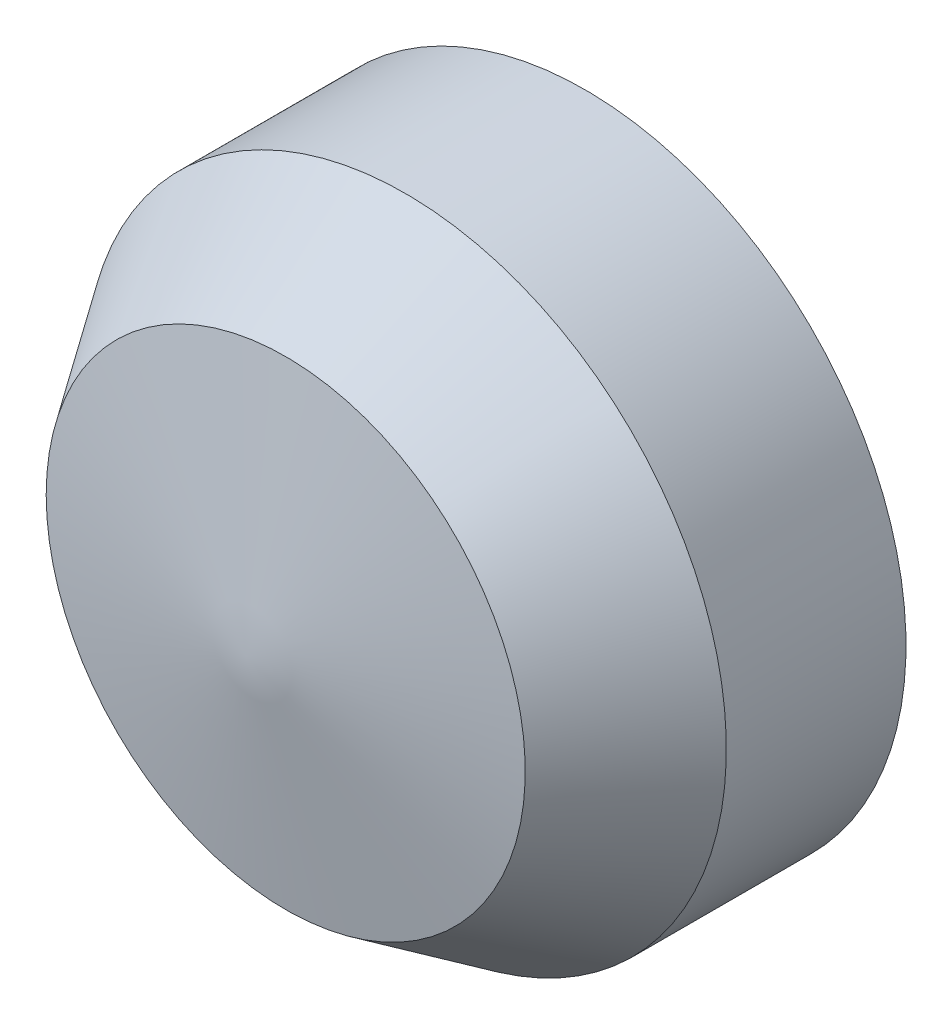
ISO-10303-21;
HEADER;
FILE_DESCRIPTION(('STEP AP214'),'2;1');
FILE_NAME('part.step','',(''),(''),'','','');
FILE_SCHEMA(('AUTOMOTIVE_DESIGN { 1 0 10303 214 1 1 1 1 }'));
ENDSEC;
DATA;
#1=APPLICATION_CONTEXT('core data for automotive mechanical design processes');
#2=APPLICATION_PROTOCOL_DEFINITION('international standard','automotive_design',2000,#1);
#3=PRODUCT_CONTEXT('',#1,'mechanical');
#4=PRODUCT('Part','Part','',(#3));
#5=PRODUCT_RELATED_PRODUCT_CATEGORY('part','',(#4));
#6=PRODUCT_DEFINITION_FORMATION('','',#4);
#7=PRODUCT_DEFINITION_CONTEXT('part definition',#1,'design');
#8=PRODUCT_DEFINITION('design','',#6,#7);
#9=PRODUCT_DEFINITION_SHAPE('','',#8);
#10=(LENGTH_UNIT() NAMED_UNIT(*) SI_UNIT(.MILLI.,.METRE.));
#11=(NAMED_UNIT(*) PLANE_ANGLE_UNIT() SI_UNIT($,.RADIAN.));
#12=(NAMED_UNIT(*) SI_UNIT($,.STERADIAN.) SOLID_ANGLE_UNIT());
#13=UNCERTAINTY_MEASURE_WITH_UNIT(LENGTH_MEASURE(1.E-05),#10,'distance_accuracy_value','');
#14=(GEOMETRIC_REPRESENTATION_CONTEXT(3) GLOBAL_UNCERTAINTY_ASSIGNED_CONTEXT((#13)) GLOBAL_UNIT_ASSIGNED_CONTEXT((#10,
#11,#12)) REPRESENTATION_CONTEXT('',''));
#15=CARTESIAN_POINT('',(0.,0.,0.));
#16=DIRECTION('',(0.,0.,1.));
#17=DIRECTION('',(1.,0.,0.));
#18=AXIS2_PLACEMENT_3D('',#15,#16,#17);
#19=CARTESIAN_POINT('',(0.,0.,34.));
#20=DIRECTION('',(0.,0.,-1.));
#21=DIRECTION('',(-1.,0.,0.));
#22=AXIS2_PLACEMENT_3D('',#19,#20,#21);
#23=CONICAL_SURFACE('',#22,0.,1.40564764938027);
#24=CARTESIAN_POINT('',(0.,0.,30.));
#25=DIRECTION('',(0.,0.,-1.));
#26=DIRECTION('',(-1.,0.,0.));
#27=AXIS2_PLACEMENT_3D('',#24,#25,#26);
#28=CIRCLE('',#27,24.);
#29=CARTESIAN_POINT('',(-24.,0.,30.));
#30=VERTEX_POINT('',#29);
#31=EDGE_CURVE('E59',#30,#30,#28,.T.);
#32=ORIENTED_EDGE('',*,*,#31,.F.);
#33=EDGE_LOOP('',(#32));
#34=FACE_BOUND('',#33,.T.);
#35=CARTESIAN_POINT('',(0.,0.,34.));
#36=VERTEX_POINT('',#35);
#37=VERTEX_LOOP('',#36);
#38=FACE_BOUND('',#37,.T.);
#39=ADVANCED_FACE('F39',(#34,#38),#23,.T.);
#40=CARTESIAN_POINT('',(0.,0.,0.));
#41=DIRECTION('',(0.,0.,1.));
#42=DIRECTION('',(1.,0.,0.));
#43=AXIS2_PLACEMENT_3D('',#40,#41,#42);
#44=PLANE('',#43);
#45=CARTESIAN_POINT('',(0.,0.,0.));
#46=DIRECTION('',(0.,0.,-1.));
#47=DIRECTION('',(-1.,0.,0.));
#48=AXIS2_PLACEMENT_3D('',#45,#46,#47);
#49=CIRCLE('',#48,32.15);
#50=CARTESIAN_POINT('',(-32.15,0.,0.));
#51=VERTEX_POINT('',#50);
#52=EDGE_CURVE('E11',#51,#51,#49,.T.);
#53=ORIENTED_EDGE('',*,*,#52,.T.);
#54=EDGE_LOOP('',(#53));
#55=FACE_BOUND('',#54,.T.);
#56=ADVANCED_FACE('F47',(#55),#44,.F.);
#57=CARTESIAN_POINT('',(0.,0.,-5.));
#58=DIRECTION('',(0.,0.,-1.));
#59=DIRECTION('',(-1.,0.,0.));
#60=AXIS2_PLACEMENT_3D('',#57,#58,#59);
#61=CYLINDRICAL_SURFACE('',#60,32.15);
#62=ORIENTED_EDGE('',*,*,#52,.F.);
#63=EDGE_LOOP('',(#62));
#64=FACE_BOUND('',#63,.T.);
#65=CARTESIAN_POINT('',(0.,0.,18.));
#66=DIRECTION('',(0.,0.,-1.));
#67=DIRECTION('',(-1.,0.,0.));
#68=AXIS2_PLACEMENT_3D('',#65,#66,#67);
#69=CIRCLE('',#68,32.15);
#70=CARTESIAN_POINT('',(-32.15,0.,18.));
#71=VERTEX_POINT('',#70);
#72=EDGE_CURVE('E44',#71,#71,#69,.T.);
#73=ORIENTED_EDGE('',*,*,#72,.T.);
#74=EDGE_LOOP('',(#73));
#75=FACE_BOUND('',#74,.T.);
#76=ADVANCED_FACE('F53',(#64,#75),#61,.T.);
#77=CARTESIAN_POINT('',(0.,0.,30.));
#78=DIRECTION('',(0.,0.,-1.));
#79=DIRECTION('',(-1.,0.,0.));
#80=AXIS2_PLACEMENT_3D('',#77,#78,#79);
#81=CONICAL_SURFACE('',#80,24.,0.596606597728023);
#82=ORIENTED_EDGE('',*,*,#72,.F.);
#83=EDGE_LOOP('',(#82));
#84=FACE_BOUND('',#83,.T.);
#85=ORIENTED_EDGE('',*,*,#31,.T.);
#86=EDGE_LOOP('',(#85));
#87=FACE_BOUND('',#86,.T.);
#88=ADVANCED_FACE('F63',(#84,#87),#81,.T.);
#89=CLOSED_SHELL('',(#39,#56,#76,#88));
#90=MANIFOLD_SOLID_BREP('B2',#89);
#91=ADVANCED_BREP_SHAPE_REPRESENTATION('',(#18,#90),#14);
#92=SHAPE_DEFINITION_REPRESENTATION(#9,#91);
ENDSEC;
END-ISO-10303-21;
